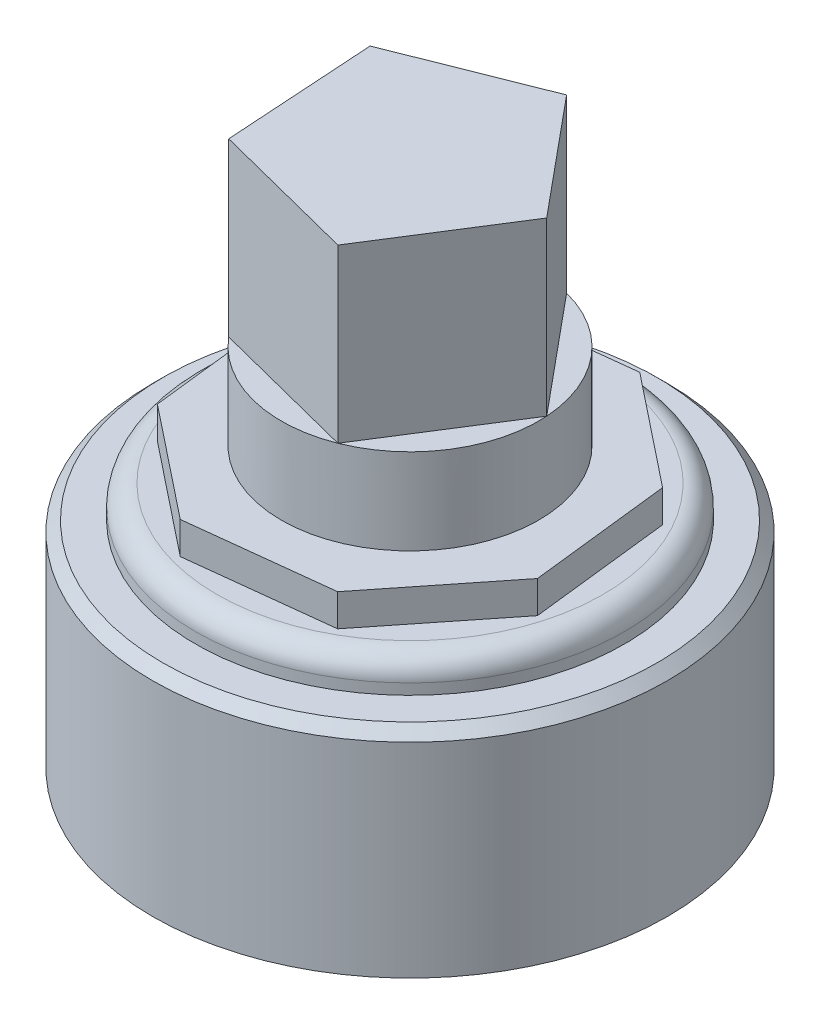
ISO-10303-21;
HEADER;
FILE_DESCRIPTION(('STEP AP214'),'2;1');
FILE_NAME('part.step','',(''),(''),'','','');
FILE_SCHEMA(('AUTOMOTIVE_DESIGN { 1 0 10303 214 1 1 1 1 }'));
ENDSEC;
DATA;
#1=APPLICATION_CONTEXT('core data for automotive mechanical design processes');
#2=APPLICATION_PROTOCOL_DEFINITION('international standard','automotive_design',2000,#1);
#3=PRODUCT_CONTEXT('',#1,'mechanical');
#4=PRODUCT('Part','Part','',(#3));
#5=PRODUCT_RELATED_PRODUCT_CATEGORY('part','',(#4));
#6=PRODUCT_DEFINITION_FORMATION('','',#4);
#7=PRODUCT_DEFINITION_CONTEXT('part definition',#1,'design');
#8=PRODUCT_DEFINITION('design','',#6,#7);
#9=PRODUCT_DEFINITION_SHAPE('','',#8);
#10=(LENGTH_UNIT() NAMED_UNIT(*) SI_UNIT(.MILLI.,.METRE.));
#11=(NAMED_UNIT(*) PLANE_ANGLE_UNIT() SI_UNIT($,.RADIAN.));
#12=(NAMED_UNIT(*) SI_UNIT($,.STERADIAN.) SOLID_ANGLE_UNIT());
#13=UNCERTAINTY_MEASURE_WITH_UNIT(LENGTH_MEASURE(1.E-05),#10,'distance_accuracy_value','');
#14=(GEOMETRIC_REPRESENTATION_CONTEXT(3) GLOBAL_UNCERTAINTY_ASSIGNED_CONTEXT((#13)) GLOBAL_UNIT_ASSIGNED_CONTEXT((#10,
#11,#12)) REPRESENTATION_CONTEXT('',''));
#15=CARTESIAN_POINT('',(0.,0.,0.));
#16=DIRECTION('',(0.,0.,1.));
#17=DIRECTION('',(1.,0.,0.));
#18=AXIS2_PLACEMENT_3D('',#15,#16,#17);
#19=CARTESIAN_POINT('',(0.,22.225,0.));
#20=DIRECTION('',(0.,1.,0.));
#21=DIRECTION('',(0.,0.,1.));
#22=AXIS2_PLACEMENT_3D('',#19,#20,#21);
#23=PLANE('',#22);
#24=DIRECTION('',(-0.638291848884375,0.,-0.769794463248318));
#25=VECTOR('',#24,1.);
#26=CARTESIAN_POINT('',(19.0110491960697,22.225,-1.21758304218559));
#27=LINE('',#26,#25);
#28=CARTESIAN_POINT('',(19.0110491960697,22.225,-1.2175830421856));
#29=VERTEX_POINT('',#28);
#30=CARTESIAN_POINT('',(4.71674699608266,22.225,-18.4568360716279));
#31=VERTEX_POINT('',#30);
#32=EDGE_CURVE('E163',#29,#31,#27,.T.);
#33=ORIENTED_EDGE('',*,*,#32,.F.);
#34=CARTESIAN_POINT('',(0.,22.225,0.));
#35=DIRECTION('',(0.,1.,0.));
#36=DIRECTION('',(0.,0.,1.));
#37=AXIS2_PLACEMENT_3D('',#34,#35,#36);
#38=CIRCLE('',#37,19.05);
#39=EDGE_CURVE('E179',#29,#31,#38,.T.);
#40=ORIENTED_EDGE('',*,*,#39,.T.);
#41=EDGE_LOOP('',(#33,#40));
#42=FACE_BOUND('',#41,.T.);
#43=ADVANCED_FACE('F41',(#42),#23,.T.);
#44=DIRECTION('',(0.534875011803966,0.,-0.844931193499037));
#45=VECTOR('',#44,1.);
#46=CARTESIAN_POINT('',(7.0327275688848,22.225,17.7043283674317));
#47=LINE('',#46,#45);
#48=CARTESIAN_POINT('',(7.03272756888481,22.225,17.7043283674317));
#49=VERTEX_POINT('',#48);
#50=EDGE_CURVE('E160',#49,#29,#47,.T.);
#51=ORIENTED_EDGE('',*,*,#50,.F.);
#52=EDGE_CURVE('E171',#49,#29,#38,.T.);
#53=ORIENTED_EDGE('',*,*,#52,.T.);
#54=EDGE_LOOP('',(#51,#53));
#55=FACE_BOUND('',#54,.T.);
#56=ADVANCED_FACE('F302',(#55),#23,.T.);
#57=DIRECTION('',(0.968862785912227,0.,0.247598267510899));
#58=VECTOR('',#57,1.);
#59=CARTESIAN_POINT('',(-14.6645845248805,22.225,12.1594597212473));
#60=LINE('',#59,#58);
#61=CARTESIAN_POINT('',(-14.6645845248804,22.225,12.1594597212474));
#62=VERTEX_POINT('',#61);
#63=EDGE_CURVE('E56',#62,#49,#60,.T.);
#64=ORIENTED_EDGE('',*,*,#63,.F.);
#65=EDGE_CURVE('E165',#62,#49,#38,.T.);
#66=ORIENTED_EDGE('',*,*,#65,.T.);
#67=EDGE_LOOP('',(#64,#66));
#68=FACE_BOUND('',#67,.T.);
#69=ADVANCED_FACE('F309',(#68),#23,.T.);
#70=DIRECTION('',(0.063915120324703,0.,0.997955338376362));
#71=VECTOR('',#70,1.);
#72=CARTESIAN_POINT('',(-16.0959392361566,22.225,-10.1893689748655));
#73=LINE('',#72,#71);
#74=CARTESIAN_POINT('',(-16.0959392361566,22.225,-10.1893689748655));
#75=VERTEX_POINT('',#74);
#76=EDGE_CURVE('E333',#75,#62,#73,.T.);
#77=ORIENTED_EDGE('',*,*,#76,.F.);
#78=EDGE_CURVE('E169',#75,#62,#38,.T.);
#79=ORIENTED_EDGE('',*,*,#78,.T.);
#80=EDGE_LOOP('',(#77,#79));
#81=FACE_BOUND('',#80,.T.);
#82=ADVANCED_FACE('F315',(#81),#23,.T.);
#83=CARTESIAN_POINT('',(0.,4.7625,0.));
#84=DIRECTION('',(0.,1.,0.));
#85=DIRECTION('',(0.,0.,1.));
#86=AXIS2_PLACEMENT_3D('',#83,#84,#85);
#87=PLANE('',#86);
#88=CARTESIAN_POINT('',(0.,4.7625,0.));
#89=DIRECTION('',(0.,1.,0.));
#90=DIRECTION('',(0.,0.,1.));
#91=AXIS2_PLACEMENT_3D('',#88,#89,#90);
#92=CIRCLE('',#91,28.575);
#93=CARTESIAN_POINT('',(0.,4.7625,28.575));
#94=VERTEX_POINT('',#93);
#95=EDGE_CURVE('E50',#94,#94,#92,.T.);
#96=ORIENTED_EDGE('',*,*,#95,.T.);
#97=EDGE_LOOP('',(#96));
#98=FACE_BOUND('',#97,.T.);
#99=DIRECTION('',(0.99354179203854,0.,-0.113466768143129));
#100=VECTOR('',#99,1.);
#101=CARTESIAN_POINT('',(-2.88205591083547,4.7625,-25.2359615177789));
#102=LINE('',#101,#100);
#103=CARTESIAN_POINT('',(-13.335133431025,4.7625,-24.0421748719933));
#104=VERTEX_POINT('',#103);
#105=CARTESIAN_POINT('',(7.57102160935409,4.7625,-26.4297481635645));
#106=VERTEX_POINT('',#105);
#107=EDGE_CURVE('E280',#104,#106,#102,.T.);
#108=ORIENTED_EDGE('',*,*,#107,.T.);
#109=DIRECTION('',(0.782773259736014,0.,0.622307017349359));
#110=VECTOR('',#109,1.);
#111=CARTESIAN_POINT('',(15.8065982406737,4.7625,-19.8824407972948));
#112=LINE('',#111,#110);
#113=CARTESIAN_POINT('',(24.0421748719933,4.7625,-13.335133431025));
#114=VERTEX_POINT('',#113);
#115=EDGE_CURVE('E184',#106,#114,#112,.T.);
#116=ORIENTED_EDGE('',*,*,#115,.T.);
#117=DIRECTION('',(0.113466768143128,0.,0.99354179203854));
#118=VECTOR('',#117,1.);
#119=CARTESIAN_POINT('',(25.2359615177789,4.7625,-2.88205591083546));
#120=LINE('',#119,#118);
#121=CARTESIAN_POINT('',(26.4297481635645,4.7625,7.57102160935408));
#122=VERTEX_POINT('',#121);
#123=EDGE_CURVE('E253',#114,#122,#120,.T.);
#124=ORIENTED_EDGE('',*,*,#123,.T.);
#125=DIRECTION('',(-0.622307017349359,0.,0.782773259736014));
#126=VECTOR('',#125,1.);
#127=CARTESIAN_POINT('',(19.8824407972947,4.7625,15.8065982406737));
#128=LINE('',#127,#126);
#129=CARTESIAN_POINT('',(13.335133431025,4.7625,24.0421748719933));
#130=VERTEX_POINT('',#129);
#131=EDGE_CURVE('E260',#122,#130,#128,.T.);
#132=ORIENTED_EDGE('',*,*,#131,.T.);
#133=DIRECTION('',(-0.99354179203854,0.,0.113466768143129));
#134=VECTOR('',#133,1.);
#135=CARTESIAN_POINT('',(2.88205591083546,4.7625,25.2359615177789));
#136=LINE('',#135,#134);
#137=CARTESIAN_POINT('',(-7.5710216093541,4.7625,26.4297481635645));
#138=VERTEX_POINT('',#137);
#139=EDGE_CURVE('E264',#130,#138,#136,.T.);
#140=ORIENTED_EDGE('',*,*,#139,.T.);
#141=DIRECTION('',(-0.782773259736014,0.,-0.622307017349359));
#142=VECTOR('',#141,1.);
#143=CARTESIAN_POINT('',(-15.8065982406737,4.7625,19.8824407972948));
#144=LINE('',#143,#142);
#145=CARTESIAN_POINT('',(-24.0421748719933,4.7625,13.335133431025));
#146=VERTEX_POINT('',#145);
#147=EDGE_CURVE('E268',#138,#146,#144,.T.);
#148=ORIENTED_EDGE('',*,*,#147,.T.);
#149=DIRECTION('',(-0.113466768143129,0.,-0.99354179203854));
#150=VECTOR('',#149,1.);
#151=CARTESIAN_POINT('',(-25.2359615177789,4.7625,2.88205591083547));
#152=LINE('',#151,#150);
#153=CARTESIAN_POINT('',(-26.4297481635645,4.7625,-7.57102160935407));
#154=VERTEX_POINT('',#153);
#155=EDGE_CURVE('E272',#146,#154,#152,.T.);
#156=ORIENTED_EDGE('',*,*,#155,.T.);
#157=DIRECTION('',(0.622307017349358,0.,-0.782773259736014));
#158=VECTOR('',#157,1.);
#159=CARTESIAN_POINT('',(-19.8824407972948,4.7625,-15.8065982406737));
#160=LINE('',#159,#158);
#161=EDGE_CURVE('E276',#154,#104,#160,.T.);
#162=ORIENTED_EDGE('',*,*,#161,.T.);
#163=EDGE_LOOP('',(#108,#116,#124,#132,#140,#148,#156,#162));
#164=FACE_BOUND('',#163,.T.);
#165=ADVANCED_FACE('F290',(#98,#164),#87,.T.);
#166=CARTESIAN_POINT('',(0.,-31.75,0.));
#167=DIRECTION('',(0.,1.,0.));
#168=DIRECTION('',(0.,0.,1.));
#169=AXIS2_PLACEMENT_3D('',#166,#167,#168);
#170=CYLINDRICAL_SURFACE('',#169,38.1);
#171=CARTESIAN_POINT('',(0.,-1.524,0.));
#172=DIRECTION('',(0.,1.,0.));
#173=DIRECTION('',(0.,0.,1.));
#174=AXIS2_PLACEMENT_3D('',#171,#172,#173);
#175=CIRCLE('',#174,38.1);
#176=CARTESIAN_POINT('',(0.,-1.524,38.1));
#177=VERTEX_POINT('',#176);
#178=EDGE_CURVE('E249',#177,#177,#175,.F.);
#179=ORIENTED_EDGE('',*,*,#178,.T.);
#180=EDGE_LOOP('',(#179));
#181=FACE_BOUND('',#180,.T.);
#182=CARTESIAN_POINT('',(0.,-31.75,0.));
#183=DIRECTION('',(0.,1.,0.));
#184=DIRECTION('',(0.,0.,1.));
#185=AXIS2_PLACEMENT_3D('',#182,#183,#184);
#186=CIRCLE('',#185,38.1);
#187=CARTESIAN_POINT('',(0.,-31.75,38.1));
#188=VERTEX_POINT('',#187);
#189=EDGE_CURVE('E241',#188,#188,#186,.T.);
#190=ORIENTED_EDGE('',*,*,#189,.T.);
#191=EDGE_LOOP('',(#190));
#192=FACE_BOUND('',#191,.T.);
#193=ADVANCED_FACE('F328',(#181,#192),#170,.T.);
#194=CARTESIAN_POINT('',(0.,-31.75,0.));
#195=DIRECTION('',(0.,1.,0.));
#196=DIRECTION('',(0.,0.,1.));
#197=AXIS2_PLACEMENT_3D('',#194,#195,#196);
#198=PLANE('',#197);
#199=ORIENTED_EDGE('',*,*,#189,.F.);
#200=EDGE_LOOP('',(#199));
#201=FACE_BOUND('',#200,.T.);
#202=ADVANCED_FACE('F439',(#201),#198,.F.);
#203=CARTESIAN_POINT('',(0.,0.,0.));
#204=DIRECTION('',(0.,1.,0.));
#205=DIRECTION('',(0.,0.,1.));
#206=AXIS2_PLACEMENT_3D('',#203,#204,#205);
#207=PLANE('',#206);
#208=CARTESIAN_POINT('',(0.,0.,0.));
#209=DIRECTION('',(0.,1.,0.));
#210=DIRECTION('',(0.,0.,1.));
#211=AXIS2_PLACEMENT_3D('',#208,#209,#210);
#212=CIRCLE('',#211,31.75);
#213=CARTESIAN_POINT('',(0.,0.,-31.75));
#214=VERTEX_POINT('',#213);
#215=EDGE_CURVE('E240',#214,#214,#212,.F.);
#216=ORIENTED_EDGE('',*,*,#215,.T.);
#217=EDGE_LOOP('',(#216));
#218=FACE_BOUND('',#217,.T.);
#219=CARTESIAN_POINT('',(0.,0.,0.));
#220=DIRECTION('',(0.,1.,0.));
#221=DIRECTION('',(0.,0.,1.));
#222=AXIS2_PLACEMENT_3D('',#219,#220,#221);
#223=CIRCLE('',#222,36.576);
#224=CARTESIAN_POINT('',(0.,0.,36.576));
#225=VERTEX_POINT('',#224);
#226=EDGE_CURVE('E245',#225,#225,#223,.T.);
#227=ORIENTED_EDGE('',*,*,#226,.T.);
#228=EDGE_LOOP('',(#227));
#229=FACE_BOUND('',#228,.T.);
#230=ADVANCED_FACE('F442',(#218,#229),#207,.T.);
#231=CARTESIAN_POINT('',(0.,0.,0.));
#232=DIRECTION('',(0.,-1.,0.));
#233=DIRECTION('',(0.,0.,-1.));
#234=AXIS2_PLACEMENT_3D('',#231,#232,#233);
#235=CONICAL_SURFACE('',#234,36.576,0.785398163397448);
#236=ORIENTED_EDGE('',*,*,#178,.F.);
#237=EDGE_LOOP('',(#236));
#238=FACE_BOUND('',#237,.T.);
#239=ORIENTED_EDGE('',*,*,#226,.F.);
#240=EDGE_LOOP('',(#239));
#241=FACE_BOUND('',#240,.T.);
#242=ADVANCED_FACE('F437',(#238,#241),#235,.T.);
#243=CARTESIAN_POINT('',(0.,4.7625,0.));
#244=DIRECTION('',(0.,-1.,0.));
#245=DIRECTION('',(0.,0.,-1.));
#246=AXIS2_PLACEMENT_3D('',#243,#244,#245);
#247=CYLINDRICAL_SURFACE('',#246,31.75);
#248=CARTESIAN_POINT('',(0.,1.5875,0.));
#249=DIRECTION('',(0.,1.,0.));
#250=DIRECTION('',(0.,0.,1.));
#251=AXIS2_PLACEMENT_3D('',#248,#249,#250);
#252=CIRCLE('',#251,31.75);
#253=CARTESIAN_POINT('',(0.,1.5875,-31.75));
#254=VERTEX_POINT('',#253);
#255=EDGE_CURVE('E11',#254,#254,#252,.F.);
#256=CARTESIAN_POINT('',(0.,1.5875,-31.75));
#257=CARTESIAN_POINT('',(0.,1.57096354166667,-31.75));
#258=CARTESIAN_POINT('',(0.,1.55442708333333,-31.75));
#259=CARTESIAN_POINT('',(0.,1.52135416666667,-31.75));
#260=CARTESIAN_POINT('',(0.,1.50481770833333,-31.75));
#261=CARTESIAN_POINT('',(0.,1.47174479166667,-31.75));
#262=CARTESIAN_POINT('',(0.,1.45520833333333,-31.75));
#263=CARTESIAN_POINT('',(0.,1.42213541666667,-31.75));
#264=CARTESIAN_POINT('',(0.,1.40559895833333,-31.75));
#265=CARTESIAN_POINT('',(0.,1.37252604166667,-31.75));
#266=CARTESIAN_POINT('',(0.,1.35598958333333,-31.75));
#267=CARTESIAN_POINT('',(0.,1.32291666666667,-31.75));
#268=CARTESIAN_POINT('',(0.,1.30638020833333,-31.75));
#269=CARTESIAN_POINT('',(0.,1.27330729166667,-31.75));
#270=CARTESIAN_POINT('',(0.,1.25677083333333,-31.75));
#271=CARTESIAN_POINT('',(0.,1.22369791666667,-31.75));
#272=CARTESIAN_POINT('',(0.,1.20716145833333,-31.75));
#273=CARTESIAN_POINT('',(0.,1.17408854166667,-31.75));
#274=CARTESIAN_POINT('',(0.,1.15755208333333,-31.75));
#275=CARTESIAN_POINT('',(0.,1.12447916666667,-31.75));
#276=CARTESIAN_POINT('',(0.,1.10794270833333,-31.75));
#277=CARTESIAN_POINT('',(0.,1.07486979166667,-31.75));
#278=CARTESIAN_POINT('',(0.,1.05833333333333,-31.75));
#279=CARTESIAN_POINT('',(0.,1.02526041666667,-31.75));
#280=CARTESIAN_POINT('',(0.,1.00872395833333,-31.75));
#281=CARTESIAN_POINT('',(0.,0.975651041666666,-31.75));
#282=CARTESIAN_POINT('',(0.,0.959114583333333,-31.75));
#283=CARTESIAN_POINT('',(0.,0.926041666666666,-31.75));
#284=CARTESIAN_POINT('',(0.,0.909505208333333,-31.75));
#285=CARTESIAN_POINT('',(0.,0.876432291666666,-31.75));
#286=CARTESIAN_POINT('',(0.,0.859895833333333,-31.75));
#287=CARTESIAN_POINT('',(0.,0.826822916666667,-31.75));
#288=CARTESIAN_POINT('',(0.,0.810286458333333,-31.75));
#289=CARTESIAN_POINT('',(0.,0.777213541666667,-31.75));
#290=CARTESIAN_POINT('',(0.,0.760677083333334,-31.75));
#291=CARTESIAN_POINT('',(0.,0.727604166666667,-31.75));
#292=CARTESIAN_POINT('',(0.,0.711067708333333,-31.75));
#293=CARTESIAN_POINT('',(0.,0.677994791666667,-31.75));
#294=CARTESIAN_POINT('',(0.,0.661458333333333,-31.75));
#295=CARTESIAN_POINT('',(0.,0.628385416666667,-31.75));
#296=CARTESIAN_POINT('',(0.,0.611848958333334,-31.75));
#297=CARTESIAN_POINT('',(0.,0.578776041666667,-31.75));
#298=CARTESIAN_POINT('',(0.,0.562239583333333,-31.75));
#299=CARTESIAN_POINT('',(0.,0.529166666666666,-31.75));
#300=CARTESIAN_POINT('',(0.,0.512630208333333,-31.75));
#301=CARTESIAN_POINT('',(0.,0.479557291666667,-31.75));
#302=CARTESIAN_POINT('',(0.,0.463020833333333,-31.75));
#303=CARTESIAN_POINT('',(0.,0.429947916666667,-31.75));
#304=CARTESIAN_POINT('',(0.,0.413411458333333,-31.75));
#305=CARTESIAN_POINT('',(0.,0.380338541666666,-31.75));
#306=CARTESIAN_POINT('',(0.,0.363802083333333,-31.75));
#307=CARTESIAN_POINT('',(0.,0.330729166666667,-31.75));
#308=CARTESIAN_POINT('',(0.,0.314192708333333,-31.75));
#309=CARTESIAN_POINT('',(0.,0.281119791666667,-31.75));
#310=CARTESIAN_POINT('',(0.,0.264583333333333,-31.75));
#311=CARTESIAN_POINT('',(0.,0.231510416666666,-31.75));
#312=CARTESIAN_POINT('',(0.,0.214973958333333,-31.75));
#313=CARTESIAN_POINT('',(0.,0.181901041666667,-31.75));
#314=CARTESIAN_POINT('',(0.,0.165364583333333,-31.75));
#315=CARTESIAN_POINT('',(0.,0.132291666666667,-31.75));
#316=CARTESIAN_POINT('',(0.,0.115755208333333,-31.75));
#317=CARTESIAN_POINT('',(0.,0.0826822916666662,-31.75));
#318=CARTESIAN_POINT('',(0.,0.066145833333333,-31.75));
#319=CARTESIAN_POINT('',(0.,0.0330729166666665,-31.75));
#320=CARTESIAN_POINT('',(0.,0.0165364583333332,-31.75));
#321=CARTESIAN_POINT('',(0.,0.,-31.75));
#322=B_SPLINE_CURVE_WITH_KNOTS('',3,(#256,#257,#258,#259,#260,#261,#262,#263,#264,#265,#266,
#267,#268,#269,#270,#271,#272,#273,#274,#275,#276,#277,#278,#279,#280,#281,#282,#283,#284,#285,
#286,#287,#288,#289,#290,#291,#292,#293,#294,#295,#296,#297,#298,#299,#300,#301,#302,#303,#304,
#305,#306,#307,#308,#309,#310,#311,#312,#313,#314,#315,#316,#317,#318,#319,#320,#321),
.UNSPECIFIED.,.F.,.F.,(4,2,2,2,2,2,2,2,2,2,2,2,2,2,2,2,2,2,2,2,2,2,2,2,2,2,2,2,2,2,2,2,4),(0.,
0.0496093750000002,0.0992187499999999,0.148828125,0.1984375,0.248046875,0.29765625,0.347265625,
0.396875,0.446484375,0.49609375,0.545703125,0.5953125,0.644921875,0.69453125,0.744140625,
0.79375,0.843359374999999,0.89296875,0.942578125,0.9921875,1.041796875,1.09140625,1.141015625,
1.190625,1.240234375,1.28984375,1.339453125,1.3890625,1.438671875,1.48828125,1.537890625,
1.5875),.UNSPECIFIED.);
#323=EDGE_CURVE('BSEAM433',#254,#214,#322,.T.);
#324=ORIENTED_EDGE('',*,*,#255,.T.);
#325=ORIENTED_EDGE('',*,*,#215,.F.);
#326=ORIENTED_EDGE('',*,*,#323,.T.);
#327=ORIENTED_EDGE('',*,*,#323,.F.);
#328=EDGE_LOOP('',(#324,#326,#325,#327));
#329=FACE_BOUND('',#328,.T.);
#330=ADVANCED_FACE('F433',(#329),#247,.T.);
#331=CARTESIAN_POINT('',(24.0421748719933,9.525,-13.335133431025));
#332=DIRECTION('',(-0.622307017349359,0.,0.782773259736014));
#333=DIRECTION('',(0.782773259736014,0.,0.622307017349359));
#334=AXIS2_PLACEMENT_3D('',#331,#332,#333);
#335=PLANE('',#334);
#336=ORIENTED_EDGE('',*,*,#115,.F.);
#337=DIRECTION('',(0.,-1.,0.));
#338=VECTOR('',#337,1.);
#339=CARTESIAN_POINT('',(7.57102160935409,9.525,-26.4297481635645));
#340=LINE('',#339,#338);
#341=CARTESIAN_POINT('',(7.57102160935409,9.525,-26.4297481635645));
#342=VERTEX_POINT('',#341);
#343=EDGE_CURVE('E236',#342,#106,#340,.T.);
#344=ORIENTED_EDGE('',*,*,#343,.F.);
#345=DIRECTION('',(-0.782773259736014,0.,-0.622307017349359));
#346=VECTOR('',#345,1.);
#347=CARTESIAN_POINT('',(24.0421748719933,9.525,-13.335133431025));
#348=LINE('',#347,#346);
#349=CARTESIAN_POINT('',(24.0421748719933,9.525,-13.335133431025));
#350=VERTEX_POINT('',#349);
#351=EDGE_CURVE('E178',#350,#342,#348,.T.);
#352=ORIENTED_EDGE('',*,*,#351,.F.);
#353=DIRECTION('',(0.,-1.,0.));
#354=VECTOR('',#353,1.);
#355=CARTESIAN_POINT('',(24.0421748719933,9.525,-13.335133431025));
#356=LINE('',#355,#354);
#357=EDGE_CURVE('E209',#350,#114,#356,.T.);
#358=ORIENTED_EDGE('',*,*,#357,.T.);
#359=EDGE_LOOP('',(#336,#344,#352,#358));
#360=FACE_BOUND('',#359,.T.);
#361=ADVANCED_FACE('F390',(#360),#335,.F.);
#362=CARTESIAN_POINT('',(7.57102160935409,9.525,-26.4297481635645));
#363=DIRECTION('',(0.113466768143129,0.,0.99354179203854));
#364=DIRECTION('',(0.99354179203854,0.,-0.113466768143129));
#365=AXIS2_PLACEMENT_3D('',#362,#363,#364);
#366=PLANE('',#365);
#367=ORIENTED_EDGE('',*,*,#107,.F.);
#368=DIRECTION('',(0.,-1.,0.));
#369=VECTOR('',#368,1.);
#370=CARTESIAN_POINT('',(-13.335133431025,9.525,-24.0421748719933));
#371=LINE('',#370,#369);
#372=CARTESIAN_POINT('',(-13.335133431025,9.525,-24.0421748719933));
#373=VERTEX_POINT('',#372);
#374=EDGE_CURVE('E232',#373,#104,#371,.T.);
#375=ORIENTED_EDGE('',*,*,#374,.F.);
#376=DIRECTION('',(-0.99354179203854,0.,0.113466768143129));
#377=VECTOR('',#376,1.);
#378=CARTESIAN_POINT('',(7.57102160935409,9.525,-26.4297481635645));
#379=LINE('',#378,#377);
#380=EDGE_CURVE('E188',#342,#373,#379,.T.);
#381=ORIENTED_EDGE('',*,*,#380,.F.);
#382=ORIENTED_EDGE('',*,*,#343,.T.);
#383=EDGE_LOOP('',(#367,#375,#381,#382));
#384=FACE_BOUND('',#383,.T.);
#385=ADVANCED_FACE('F392',(#384),#366,.F.);
#386=CARTESIAN_POINT('',(-13.335133431025,9.525,-24.0421748719933));
#387=DIRECTION('',(0.782773259736014,0.,0.622307017349358));
#388=DIRECTION('',(0.622307017349358,0.,-0.782773259736014));
#389=AXIS2_PLACEMENT_3D('',#386,#387,#388);
#390=PLANE('',#389);
#391=ORIENTED_EDGE('',*,*,#161,.F.);
#392=DIRECTION('',(0.,-1.,0.));
#393=VECTOR('',#392,1.);
#394=CARTESIAN_POINT('',(-26.4297481635645,9.525,-7.57102160935407));
#395=LINE('',#394,#393);
#396=CARTESIAN_POINT('',(-26.4297481635645,9.525,-7.57102160935407));
#397=VERTEX_POINT('',#396);
#398=EDGE_CURVE('E228',#397,#154,#395,.T.);
#399=ORIENTED_EDGE('',*,*,#398,.F.);
#400=DIRECTION('',(-0.622307017349358,0.,0.782773259736014));
#401=VECTOR('',#400,1.);
#402=CARTESIAN_POINT('',(-13.335133431025,9.525,-24.0421748719933));
#403=LINE('',#402,#401);
#404=EDGE_CURVE('E191',#373,#397,#403,.T.);
#405=ORIENTED_EDGE('',*,*,#404,.F.);
#406=ORIENTED_EDGE('',*,*,#374,.T.);
#407=EDGE_LOOP('',(#391,#399,#405,#406));
#408=FACE_BOUND('',#407,.T.);
#409=ADVANCED_FACE('F395',(#408),#390,.F.);
#410=CARTESIAN_POINT('',(-26.4297481635645,9.525,-7.57102160935407));
#411=DIRECTION('',(0.99354179203854,0.,-0.113466768143129));
#412=DIRECTION('',(-0.113466768143129,0.,-0.99354179203854));
#413=AXIS2_PLACEMENT_3D('',#410,#411,#412);
#414=PLANE('',#413);
#415=ORIENTED_EDGE('',*,*,#155,.F.);
#416=DIRECTION('',(0.,-1.,0.));
#417=VECTOR('',#416,1.);
#418=CARTESIAN_POINT('',(-24.0421748719933,9.525,13.335133431025));
#419=LINE('',#418,#417);
#420=CARTESIAN_POINT('',(-24.0421748719933,9.525,13.335133431025));
#421=VERTEX_POINT('',#420);
#422=EDGE_CURVE('E224',#421,#146,#419,.T.);
#423=ORIENTED_EDGE('',*,*,#422,.F.);
#424=DIRECTION('',(0.113466768143129,0.,0.99354179203854));
#425=VECTOR('',#424,1.);
#426=CARTESIAN_POINT('',(-26.4297481635645,9.525,-7.57102160935407));
#427=LINE('',#426,#425);
#428=EDGE_CURVE('E194',#397,#421,#427,.T.);
#429=ORIENTED_EDGE('',*,*,#428,.F.);
#430=ORIENTED_EDGE('',*,*,#398,.T.);
#431=EDGE_LOOP('',(#415,#423,#429,#430));
#432=FACE_BOUND('',#431,.T.);
#433=ADVANCED_FACE('F399',(#432),#414,.F.);
#434=CARTESIAN_POINT('',(-24.0421748719933,9.525,13.335133431025));
#435=DIRECTION('',(0.622307017349358,0.,-0.782773259736014));
#436=DIRECTION('',(-0.782773259736014,0.,-0.622307017349359));
#437=AXIS2_PLACEMENT_3D('',#434,#435,#436);
#438=PLANE('',#437);
#439=ORIENTED_EDGE('',*,*,#147,.F.);
#440=DIRECTION('',(0.,-1.,0.));
#441=VECTOR('',#440,1.);
#442=CARTESIAN_POINT('',(-7.5710216093541,9.525,26.4297481635645));
#443=LINE('',#442,#441);
#444=CARTESIAN_POINT('',(-7.5710216093541,9.525,26.4297481635645));
#445=VERTEX_POINT('',#444);
#446=EDGE_CURVE('E220',#445,#138,#443,.T.);
#447=ORIENTED_EDGE('',*,*,#446,.F.);
#448=DIRECTION('',(0.782773259736014,0.,0.622307017349359));
#449=VECTOR('',#448,1.);
#450=CARTESIAN_POINT('',(-24.0421748719933,9.525,13.335133431025));
#451=LINE('',#450,#449);
#452=EDGE_CURVE('E197',#421,#445,#451,.T.);
#453=ORIENTED_EDGE('',*,*,#452,.F.);
#454=ORIENTED_EDGE('',*,*,#422,.T.);
#455=EDGE_LOOP('',(#439,#447,#453,#454));
#456=FACE_BOUND('',#455,.T.);
#457=ADVANCED_FACE('F406',(#456),#438,.F.);
#458=CARTESIAN_POINT('',(-7.5710216093541,9.525,26.4297481635645));
#459=DIRECTION('',(-0.113466768143129,0.,-0.99354179203854));
#460=DIRECTION('',(-0.99354179203854,0.,0.113466768143129));
#461=AXIS2_PLACEMENT_3D('',#458,#459,#460);
#462=PLANE('',#461);
#463=ORIENTED_EDGE('',*,*,#139,.F.);
#464=DIRECTION('',(0.,-1.,0.));
#465=VECTOR('',#464,1.);
#466=CARTESIAN_POINT('',(13.335133431025,9.525,24.0421748719933));
#467=LINE('',#466,#465);
#468=CARTESIAN_POINT('',(13.335133431025,9.525,24.0421748719933));
#469=VERTEX_POINT('',#468);
#470=EDGE_CURVE('E216',#469,#130,#467,.T.);
#471=ORIENTED_EDGE('',*,*,#470,.F.);
#472=DIRECTION('',(0.99354179203854,0.,-0.113466768143129));
#473=VECTOR('',#472,1.);
#474=CARTESIAN_POINT('',(-7.5710216093541,9.525,26.4297481635645));
#475=LINE('',#474,#473);
#476=EDGE_CURVE('E200',#445,#469,#475,.T.);
#477=ORIENTED_EDGE('',*,*,#476,.F.);
#478=ORIENTED_EDGE('',*,*,#446,.T.);
#479=EDGE_LOOP('',(#463,#471,#477,#478));
#480=FACE_BOUND('',#479,.T.);
#481=ADVANCED_FACE('F408',(#480),#462,.F.);
#482=CARTESIAN_POINT('',(13.335133431025,9.525,24.0421748719933));
#483=DIRECTION('',(-0.782773259736014,0.,-0.622307017349359));
#484=DIRECTION('',(-0.622307017349359,0.,0.782773259736014));
#485=AXIS2_PLACEMENT_3D('',#482,#483,#484);
#486=PLANE('',#485);
#487=ORIENTED_EDGE('',*,*,#131,.F.);
#488=DIRECTION('',(0.,-1.,0.));
#489=VECTOR('',#488,1.);
#490=CARTESIAN_POINT('',(26.4297481635645,9.525,7.57102160935408));
#491=LINE('',#490,#489);
#492=CARTESIAN_POINT('',(26.4297481635645,9.525,7.57102160935408));
#493=VERTEX_POINT('',#492);
#494=EDGE_CURVE('E213',#493,#122,#491,.T.);
#495=ORIENTED_EDGE('',*,*,#494,.F.);
#496=DIRECTION('',(0.622307017349359,0.,-0.782773259736014));
#497=VECTOR('',#496,1.);
#498=CARTESIAN_POINT('',(13.335133431025,9.525,24.0421748719933));
#499=LINE('',#498,#497);
#500=EDGE_CURVE('E203',#469,#493,#499,.T.);
#501=ORIENTED_EDGE('',*,*,#500,.F.);
#502=ORIENTED_EDGE('',*,*,#470,.T.);
#503=EDGE_LOOP('',(#487,#495,#501,#502));
#504=FACE_BOUND('',#503,.T.);
#505=ADVANCED_FACE('F413',(#504),#486,.F.);
#506=CARTESIAN_POINT('',(26.4297481635645,9.525,7.57102160935408));
#507=DIRECTION('',(-0.99354179203854,0.,0.113466768143128));
#508=DIRECTION('',(0.113466768143128,0.,0.99354179203854));
#509=AXIS2_PLACEMENT_3D('',#506,#507,#508);
#510=PLANE('',#509);
#511=ORIENTED_EDGE('',*,*,#123,.F.);
#512=ORIENTED_EDGE('',*,*,#357,.F.);
#513=DIRECTION('',(-0.113466768143128,0.,-0.99354179203854));
#514=VECTOR('',#513,1.);
#515=CARTESIAN_POINT('',(26.4297481635645,9.525,7.57102160935408));
#516=LINE('',#515,#514);
#517=EDGE_CURVE('E206',#493,#350,#516,.T.);
#518=ORIENTED_EDGE('',*,*,#517,.F.);
#519=ORIENTED_EDGE('',*,*,#494,.T.);
#520=EDGE_LOOP('',(#511,#512,#518,#519));
#521=FACE_BOUND('',#520,.T.);
#522=ADVANCED_FACE('F382',(#521),#510,.F.);
#523=CARTESIAN_POINT('',(0.,9.525,0.));
#524=DIRECTION('',(0.,1.,0.));
#525=DIRECTION('',(0.,0.,1.));
#526=AXIS2_PLACEMENT_3D('',#523,#524,#525);
#527=PLANE('',#526);
#528=CARTESIAN_POINT('',(0.,9.525,0.));
#529=DIRECTION('',(0.,1.,0.));
#530=DIRECTION('',(0.,0.,1.));
#531=AXIS2_PLACEMENT_3D('',#528,#529,#530);
#532=CIRCLE('',#531,19.05);
#533=CARTESIAN_POINT('',(0.,9.525,19.05));
#534=VERTEX_POINT('',#533);
#535=EDGE_CURVE('E180',#534,#534,#532,.T.);
#536=ORIENTED_EDGE('',*,*,#535,.F.);
#537=EDGE_LOOP('',(#536));
#538=FACE_BOUND('',#537,.T.);
#539=ORIENTED_EDGE('',*,*,#351,.T.);
#540=ORIENTED_EDGE('',*,*,#380,.T.);
#541=ORIENTED_EDGE('',*,*,#404,.T.);
#542=ORIENTED_EDGE('',*,*,#428,.T.);
#543=ORIENTED_EDGE('',*,*,#452,.T.);
#544=ORIENTED_EDGE('',*,*,#476,.T.);
#545=ORIENTED_EDGE('',*,*,#500,.T.);
#546=ORIENTED_EDGE('',*,*,#517,.T.);
#547=EDGE_LOOP('',(#539,#540,#541,#542,#543,#544,#545,#546));
#548=FACE_BOUND('',#547,.T.);
#549=ADVANCED_FACE('F320',(#538,#548),#527,.T.);
#550=CARTESIAN_POINT('',(0.,22.225,0.));
#551=DIRECTION('',(0.,-1.,0.));
#552=DIRECTION('',(0.,0.,-1.));
#553=AXIS2_PLACEMENT_3D('',#550,#551,#552);
#554=CYLINDRICAL_SURFACE('',#553,19.05);
#555=ORIENTED_EDGE('',*,*,#52,.F.);
#556=ORIENTED_EDGE('',*,*,#65,.F.);
#557=ORIENTED_EDGE('',*,*,#78,.F.);
#558=EDGE_CURVE('E374',#31,#75,#38,.T.);
#559=ORIENTED_EDGE('',*,*,#558,.F.);
#560=ORIENTED_EDGE('',*,*,#39,.F.);
#561=EDGE_LOOP('',(#555,#556,#557,#559,#560));
#562=FACE_BOUND('',#561,.T.);
#563=ORIENTED_EDGE('',*,*,#535,.T.);
#564=EDGE_LOOP('',(#563));
#565=FACE_BOUND('',#564,.T.);
#566=ADVANCED_FACE('F314',(#562,#565),#554,.T.);
#567=DIRECTION('',(-0.929361069156521,0.,0.369172050860094));
#568=VECTOR('',#567,1.);
#569=CARTESIAN_POINT('',(4.71674699608264,22.225,-18.4568360716279));
#570=LINE('',#569,#568);
#571=EDGE_CURVE('E63',#31,#75,#570,.T.);
#572=ORIENTED_EDGE('',*,*,#571,.F.);
#573=ORIENTED_EDGE('',*,*,#558,.T.);
#574=EDGE_LOOP('',(#572,#573));
#575=FACE_BOUND('',#574,.T.);
#576=ADVANCED_FACE('F305',(#575),#23,.T.);
#577=CARTESIAN_POINT('',(19.0110491960697,47.625,-1.21758304218559));
#578=DIRECTION('',(-0.769794463248318,0.,0.638291848884375));
#579=DIRECTION('',(0.638291848884375,0.,0.769794463248319));
#580=AXIS2_PLACEMENT_3D('',#577,#578,#579);
#581=PLANE('',#580);
#582=ORIENTED_EDGE('',*,*,#32,.T.);
#583=DIRECTION('',(0.,-1.,0.));
#584=VECTOR('',#583,1.);
#585=CARTESIAN_POINT('',(4.71674699608264,47.625,-18.4568360716279));
#586=LINE('',#585,#584);
#587=CARTESIAN_POINT('',(4.71674699608264,47.625,-18.4568360716279));
#588=VERTEX_POINT('',#587);
#589=EDGE_CURVE('E142',#588,#31,#586,.T.);
#590=ORIENTED_EDGE('',*,*,#589,.F.);
#591=DIRECTION('',(-0.638291848884375,0.,-0.769794463248318));
#592=VECTOR('',#591,1.);
#593=CARTESIAN_POINT('',(19.0110491960697,47.625,-1.21758304218559));
#594=LINE('',#593,#592);
#595=CARTESIAN_POINT('',(19.0110491960697,47.625,-1.21758304218559));
#596=VERTEX_POINT('',#595);
#597=EDGE_CURVE('E150',#596,#588,#594,.T.);
#598=ORIENTED_EDGE('',*,*,#597,.F.);
#599=DIRECTION('',(0.,-1.,0.));
#600=VECTOR('',#599,1.);
#601=CARTESIAN_POINT('',(19.0110491960697,47.625,-1.21758304218559));
#602=LINE('',#601,#600);
#603=EDGE_CURVE('E352',#596,#29,#602,.T.);
#604=ORIENTED_EDGE('',*,*,#603,.T.);
#605=EDGE_LOOP('',(#582,#590,#598,#604));
#606=FACE_BOUND('',#605,.T.);
#607=ADVANCED_FACE('F162',(#606),#581,.F.);
#608=CARTESIAN_POINT('',(4.71674699608264,47.625,-18.4568360716279));
#609=DIRECTION('',(0.369172050860094,0.,0.929361069156521));
#610=DIRECTION('',(0.929361069156521,0.,-0.369172050860095));
#611=AXIS2_PLACEMENT_3D('',#608,#609,#610);
#612=PLANE('',#611);
#613=ORIENTED_EDGE('',*,*,#571,.T.);
#614=DIRECTION('',(0.,-1.,0.));
#615=VECTOR('',#614,1.);
#616=CARTESIAN_POINT('',(-16.0959392361566,47.625,-10.1893689748655));
#617=LINE('',#616,#615);
#618=CARTESIAN_POINT('',(-16.0959392361566,47.625,-10.1893689748655));
#619=VERTEX_POINT('',#618);
#620=EDGE_CURVE('E145',#619,#75,#617,.T.);
#621=ORIENTED_EDGE('',*,*,#620,.F.);
#622=DIRECTION('',(-0.929361069156521,0.,0.369172050860094));
#623=VECTOR('',#622,1.);
#624=CARTESIAN_POINT('',(4.71674699608264,47.625,-18.4568360716279));
#625=LINE('',#624,#623);
#626=EDGE_CURVE('E138',#588,#619,#625,.T.);
#627=ORIENTED_EDGE('',*,*,#626,.F.);
#628=ORIENTED_EDGE('',*,*,#589,.T.);
#629=EDGE_LOOP('',(#613,#621,#627,#628));
#630=FACE_BOUND('',#629,.T.);
#631=ADVANCED_FACE('F140',(#630),#612,.F.);
#632=CARTESIAN_POINT('',(-16.0959392361566,47.625,-10.1893689748655));
#633=DIRECTION('',(0.997955338376362,0.,-0.063915120324703));
#634=DIRECTION('',(-0.063915120324703,0.,-0.997955338376362));
#635=AXIS2_PLACEMENT_3D('',#632,#633,#634);
#636=PLANE('',#635);
#637=ORIENTED_EDGE('',*,*,#76,.T.);
#638=DIRECTION('',(0.,-1.,0.));
#639=VECTOR('',#638,1.);
#640=CARTESIAN_POINT('',(-14.6645845248805,47.625,12.1594597212473));
#641=LINE('',#640,#639);
#642=CARTESIAN_POINT('',(-14.6645845248805,47.625,12.1594597212473));
#643=VERTEX_POINT('',#642);
#644=EDGE_CURVE('E172',#643,#62,#641,.T.);
#645=ORIENTED_EDGE('',*,*,#644,.F.);
#646=DIRECTION('',(0.063915120324703,0.,0.997955338376362));
#647=VECTOR('',#646,1.);
#648=CARTESIAN_POINT('',(-16.0959392361566,47.625,-10.1893689748655));
#649=LINE('',#648,#647);
#650=EDGE_CURVE('E149',#619,#643,#649,.T.);
#651=ORIENTED_EDGE('',*,*,#650,.F.);
#652=ORIENTED_EDGE('',*,*,#620,.T.);
#653=EDGE_LOOP('',(#637,#645,#651,#652));
#654=FACE_BOUND('',#653,.T.);
#655=ADVANCED_FACE('F342',(#654),#636,.F.);
#656=CARTESIAN_POINT('',(-14.6645845248805,47.625,12.1594597212473));
#657=DIRECTION('',(0.247598267510899,0.,-0.968862785912227));
#658=DIRECTION('',(-0.968862785912227,0.,-0.247598267510899));
#659=AXIS2_PLACEMENT_3D('',#656,#657,#658);
#660=PLANE('',#659);
#661=ORIENTED_EDGE('',*,*,#63,.T.);
#662=DIRECTION('',(0.,-1.,0.));
#663=VECTOR('',#662,1.);
#664=CARTESIAN_POINT('',(7.0327275688848,47.625,17.7043283674317));
#665=LINE('',#664,#663);
#666=CARTESIAN_POINT('',(7.0327275688848,47.625,17.7043283674317));
#667=VERTEX_POINT('',#666);
#668=EDGE_CURVE('E362',#667,#49,#665,.T.);
#669=ORIENTED_EDGE('',*,*,#668,.F.);
#670=DIRECTION('',(0.968862785912227,0.,0.247598267510899));
#671=VECTOR('',#670,1.);
#672=CARTESIAN_POINT('',(-14.6645845248805,47.625,12.1594597212473));
#673=LINE('',#672,#671);
#674=EDGE_CURVE('E345',#643,#667,#673,.T.);
#675=ORIENTED_EDGE('',*,*,#674,.F.);
#676=ORIENTED_EDGE('',*,*,#644,.T.);
#677=EDGE_LOOP('',(#661,#669,#675,#676));
#678=FACE_BOUND('',#677,.T.);
#679=ADVANCED_FACE('F367',(#678),#660,.F.);
#680=CARTESIAN_POINT('',(7.0327275688848,47.625,17.7043283674317));
#681=DIRECTION('',(-0.844931193499037,0.,-0.534875011803966));
#682=DIRECTION('',(-0.534875011803966,0.,0.844931193499037));
#683=AXIS2_PLACEMENT_3D('',#680,#681,#682);
#684=PLANE('',#683);
#685=ORIENTED_EDGE('',*,*,#50,.T.);
#686=ORIENTED_EDGE('',*,*,#603,.F.);
#687=DIRECTION('',(0.534875011803966,0.,-0.844931193499037));
#688=VECTOR('',#687,1.);
#689=CARTESIAN_POINT('',(7.0327275688848,47.625,17.7043283674317));
#690=LINE('',#689,#688);
#691=EDGE_CURVE('E155',#667,#596,#690,.T.);
#692=ORIENTED_EDGE('',*,*,#691,.F.);
#693=ORIENTED_EDGE('',*,*,#668,.T.);
#694=EDGE_LOOP('',(#685,#686,#692,#693));
#695=FACE_BOUND('',#694,.T.);
#696=ADVANCED_FACE('F298',(#695),#684,.F.);
#697=CARTESIAN_POINT('',(0.,47.625,0.));
#698=DIRECTION('',(0.,1.,0.));
#699=DIRECTION('',(0.,0.,1.));
#700=AXIS2_PLACEMENT_3D('',#697,#698,#699);
#701=PLANE('',#700);
#702=ORIENTED_EDGE('',*,*,#597,.T.);
#703=ORIENTED_EDGE('',*,*,#626,.T.);
#704=ORIENTED_EDGE('',*,*,#650,.T.);
#705=ORIENTED_EDGE('',*,*,#674,.T.);
#706=ORIENTED_EDGE('',*,*,#691,.T.);
#707=EDGE_LOOP('',(#702,#703,#704,#705,#706));
#708=FACE_BOUND('',#707,.T.);
#709=ADVANCED_FACE('F153',(#708),#701,.T.);
#710=CARTESIAN_POINT('',(0.,1.5875,0.));
#711=DIRECTION('',(0.,1.,0.));
#712=DIRECTION('',(0.,0.,1.));
#713=AXIS2_PLACEMENT_3D('',#710,#711,#712);
#714=TOROIDAL_SURFACE('',#713,28.575,3.175);
#715=ORIENTED_EDGE('',*,*,#255,.F.);
#716=EDGE_LOOP('',(#715));
#717=FACE_BOUND('',#716,.T.);
#718=ORIENTED_EDGE('',*,*,#95,.F.);
#719=EDGE_LOOP('',(#718));
#720=FACE_BOUND('',#719,.T.);
#721=ADVANCED_FACE('F43',(#717,#720),#714,.T.);
#722=CLOSED_SHELL('',(#43,#56,#69,#82,#165,#193,#202,#230,#242,#330,#361,#385,#409,#433,#457,
#481,#505,#522,#549,#566,#576,#607,#631,#655,#679,#696,#709,#721));
#723=MANIFOLD_SOLID_BREP('B2',#722);
#724=ADVANCED_BREP_SHAPE_REPRESENTATION('',(#18,#723),#14);
#725=SHAPE_DEFINITION_REPRESENTATION(#9,#724);
ENDSEC;
END-ISO-10303-21;
